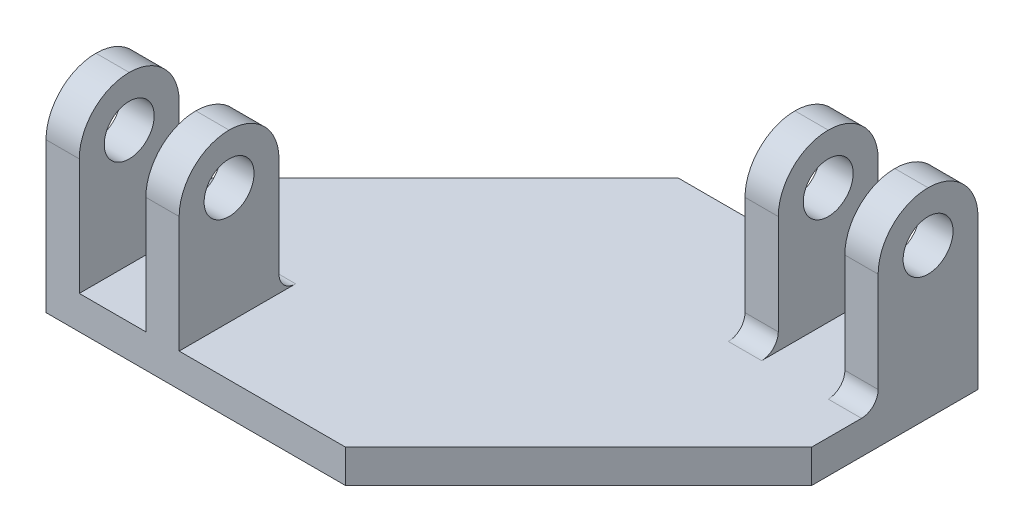
ISO-10303-21;
HEADER;
FILE_DESCRIPTION(('STEP AP214'),'2;1');
FILE_NAME('part.step','',(''),(''),'','','');
FILE_SCHEMA(('AUTOMOTIVE_DESIGN { 1 0 10303 214 1 1 1 1 }'));
ENDSEC;
DATA;
#1=APPLICATION_CONTEXT('core data for automotive mechanical design processes');
#2=APPLICATION_PROTOCOL_DEFINITION('international standard','automotive_design',2000,#1);
#3=PRODUCT_CONTEXT('',#1,'mechanical');
#4=PRODUCT('Part','Part','',(#3));
#5=PRODUCT_RELATED_PRODUCT_CATEGORY('part','',(#4));
#6=PRODUCT_DEFINITION_FORMATION('','',#4);
#7=PRODUCT_DEFINITION_CONTEXT('part definition',#1,'design');
#8=PRODUCT_DEFINITION('design','',#6,#7);
#9=PRODUCT_DEFINITION_SHAPE('','',#8);
#10=(LENGTH_UNIT() NAMED_UNIT(*) SI_UNIT(.MILLI.,.METRE.));
#11=(NAMED_UNIT(*) PLANE_ANGLE_UNIT() SI_UNIT($,.RADIAN.));
#12=(NAMED_UNIT(*) SI_UNIT($,.STERADIAN.) SOLID_ANGLE_UNIT());
#13=UNCERTAINTY_MEASURE_WITH_UNIT(LENGTH_MEASURE(1.E-05),#10,'distance_accuracy_value','');
#14=(GEOMETRIC_REPRESENTATION_CONTEXT(3) GLOBAL_UNCERTAINTY_ASSIGNED_CONTEXT((#13)) GLOBAL_UNIT_ASSIGNED_CONTEXT((#10,
#11,#12)) REPRESENTATION_CONTEXT('',''));
#15=CARTESIAN_POINT('',(0.,0.,0.));
#16=DIRECTION('',(0.,0.,1.));
#17=DIRECTION('',(1.,0.,0.));
#18=AXIS2_PLACEMENT_3D('',#15,#16,#17);
#19=CARTESIAN_POINT('',(0.,6.35,0.));
#20=DIRECTION('',(0.,1.,0.));
#21=DIRECTION('',(0.,0.,1.));
#22=AXIS2_PLACEMENT_3D('',#19,#20,#21);
#23=PLANE('',#22);
#24=DIRECTION('',(1.,0.,0.));
#25=VECTOR('',#24,1.);
#26=CARTESIAN_POINT('',(50.8,6.35,38.1));
#27=LINE('',#26,#25);
#28=CARTESIAN_POINT('',(-25.4,6.35,38.1));
#29=VERTEX_POINT('',#28);
#30=CARTESIAN_POINT('',(6.34999999999986,6.35,38.1));
#31=VERTEX_POINT('',#30);
#32=EDGE_CURVE('E294',#29,#31,#27,.T.);
#33=ORIENTED_EDGE('',*,*,#32,.T.);
#34=DIRECTION('',(-0.707106781186549,0.,0.707106781186546));
#35=VECTOR('',#34,1.);
#36=CARTESIAN_POINT('',(22.2249999999999,6.35,22.225));
#37=LINE('',#36,#35);
#38=CARTESIAN_POINT('',(50.8,6.35,-6.34999999999997));
#39=VERTEX_POINT('',#38);
#40=EDGE_CURVE('E439',#31,#39,#37,.F.);
#41=ORIENTED_EDGE('',*,*,#40,.T.);
#42=DIRECTION('',(0.,0.,-1.));
#43=VECTOR('',#42,1.);
#44=CARTESIAN_POINT('',(50.8,6.35,38.1));
#45=LINE('',#44,#43);
#46=CARTESIAN_POINT('',(50.8,6.35,-15.875));
#47=VERTEX_POINT('',#46);
#48=EDGE_CURVE('E299',#39,#47,#45,.T.);
#49=ORIENTED_EDGE('',*,*,#48,.T.);
#50=DIRECTION('',(-1.,0.,0.));
#51=VECTOR('',#50,1.);
#52=CARTESIAN_POINT('',(44.45,6.35,-15.875));
#53=LINE('',#52,#51);
#54=CARTESIAN_POINT('',(44.45,6.35,-15.875));
#55=VERTEX_POINT('',#54);
#56=EDGE_CURVE('E248',#47,#55,#53,.T.);
#57=ORIENTED_EDGE('',*,*,#56,.T.);
#58=DIRECTION('',(0.,0.,1.));
#59=VECTOR('',#58,1.);
#60=CARTESIAN_POINT('',(44.45,6.35,0.));
#61=LINE('',#60,#59);
#62=CARTESIAN_POINT('',(44.45,6.35,-38.1));
#63=VERTEX_POINT('',#62);
#64=EDGE_CURVE('E226',#63,#55,#61,.T.);
#65=ORIENTED_EDGE('',*,*,#64,.F.);
#66=DIRECTION('',(-1.,0.,0.));
#67=VECTOR('',#66,1.);
#68=CARTESIAN_POINT('',(50.8,6.35,-38.1));
#69=LINE('',#68,#67);
#70=CARTESIAN_POINT('',(31.75,6.35,-38.1));
#71=VERTEX_POINT('',#70);
#72=EDGE_CURVE('E236',#63,#71,#69,.T.);
#73=ORIENTED_EDGE('',*,*,#72,.T.);
#74=DIRECTION('',(0.,0.,1.));
#75=VECTOR('',#74,1.);
#76=CARTESIAN_POINT('',(31.75,6.35,0.));
#77=LINE('',#76,#75);
#78=CARTESIAN_POINT('',(31.75,6.35,-15.875));
#79=VERTEX_POINT('',#78);
#80=EDGE_CURVE('E232',#71,#79,#77,.T.);
#81=ORIENTED_EDGE('',*,*,#80,.T.);
#82=DIRECTION('',(-1.,0.,0.));
#83=VECTOR('',#82,1.);
#84=CARTESIAN_POINT('',(25.4,6.35,-15.875));
#85=LINE('',#84,#83);
#86=CARTESIAN_POINT('',(25.4,6.35,-15.875));
#87=VERTEX_POINT('',#86);
#88=EDGE_CURVE('E328',#79,#87,#85,.T.);
#89=ORIENTED_EDGE('',*,*,#88,.T.);
#90=DIRECTION('',(0.,0.,1.));
#91=VECTOR('',#90,1.);
#92=CARTESIAN_POINT('',(25.4,6.35,0.));
#93=LINE('',#92,#91);
#94=CARTESIAN_POINT('',(25.4,6.35,-38.1));
#95=VERTEX_POINT('',#94);
#96=EDGE_CURVE('E260',#95,#87,#93,.T.);
#97=ORIENTED_EDGE('',*,*,#96,.F.);
#98=CARTESIAN_POINT('',(-6.34999999999984,6.35,-38.1));
#99=VERTEX_POINT('',#98);
#100=EDGE_CURVE('E243',#95,#99,#69,.T.);
#101=ORIENTED_EDGE('',*,*,#100,.T.);
#102=DIRECTION('',(0.707106781186549,0.,-0.707106781186546));
#103=VECTOR('',#102,1.);
#104=CARTESIAN_POINT('',(-22.2249999999999,6.35,-22.225));
#105=LINE('',#104,#103);
#106=CARTESIAN_POINT('',(-50.8,6.35,6.35));
#107=VERTEX_POINT('',#106);
#108=EDGE_CURVE('E52',#99,#107,#105,.F.);
#109=ORIENTED_EDGE('',*,*,#108,.T.);
#110=DIRECTION('',(0.,0.,1.));
#111=VECTOR('',#110,1.);
#112=CARTESIAN_POINT('',(-50.8,6.35,38.1));
#113=LINE('',#112,#111);
#114=CARTESIAN_POINT('',(-50.8,6.35,15.875));
#115=VERTEX_POINT('',#114);
#116=EDGE_CURVE('E292',#107,#115,#113,.T.);
#117=ORIENTED_EDGE('',*,*,#116,.T.);
#118=DIRECTION('',(1.,0.,0.));
#119=VECTOR('',#118,1.);
#120=CARTESIAN_POINT('',(-44.45,6.35,15.875));
#121=LINE('',#120,#119);
#122=CARTESIAN_POINT('',(-44.45,6.35,15.875));
#123=VERTEX_POINT('',#122);
#124=EDGE_CURVE('E325',#115,#123,#121,.T.);
#125=ORIENTED_EDGE('',*,*,#124,.T.);
#126=DIRECTION('',(0.,0.,1.));
#127=VECTOR('',#126,1.);
#128=CARTESIAN_POINT('',(-44.45,6.35,0.));
#129=LINE('',#128,#127);
#130=CARTESIAN_POINT('',(-44.45,6.35,38.1));
#131=VERTEX_POINT('',#130);
#132=EDGE_CURVE('E282',#123,#131,#129,.T.);
#133=ORIENTED_EDGE('',*,*,#132,.T.);
#134=CARTESIAN_POINT('',(-31.75,6.35,38.1));
#135=VERTEX_POINT('',#134);
#136=EDGE_CURVE('E296',#131,#135,#27,.T.);
#137=ORIENTED_EDGE('',*,*,#136,.T.);
#138=DIRECTION('',(0.,0.,1.));
#139=VECTOR('',#138,1.);
#140=CARTESIAN_POINT('',(-31.75,6.35,0.));
#141=LINE('',#140,#139);
#142=CARTESIAN_POINT('',(-31.75,6.35,15.875));
#143=VERTEX_POINT('',#142);
#144=EDGE_CURVE('E269',#143,#135,#141,.T.);
#145=ORIENTED_EDGE('',*,*,#144,.F.);
#146=DIRECTION('',(1.,0.,0.));
#147=VECTOR('',#146,1.);
#148=CARTESIAN_POINT('',(-25.4,6.35,15.875));
#149=LINE('',#148,#147);
#150=CARTESIAN_POINT('',(-25.4,6.35,15.875));
#151=VERTEX_POINT('',#150);
#152=EDGE_CURVE('E313',#143,#151,#149,.T.);
#153=ORIENTED_EDGE('',*,*,#152,.T.);
#154=DIRECTION('',(0.,0.,-1.));
#155=VECTOR('',#154,1.);
#156=CARTESIAN_POINT('',(-25.4,6.35,0.));
#157=LINE('',#156,#155);
#158=EDGE_CURVE('E272',#29,#151,#157,.T.);
#159=ORIENTED_EDGE('',*,*,#158,.F.);
#160=EDGE_LOOP('',(#33,#41,#49,#57,#65,#73,#81,#89,#97,#101,#109,#117,#125,#133,#137,#145,#153,#159));
#161=FACE_BOUND('',#160,.T.);
#162=ADVANCED_FACE('F37',(#161),#23,.T.);
#163=CARTESIAN_POINT('',(-50.8,6.35,38.1));
#164=DIRECTION('',(1.,0.,0.));
#165=DIRECTION('',(0.,0.,-1.));
#166=AXIS2_PLACEMENT_3D('',#163,#164,#165);
#167=PLANE('',#166);
#168=CARTESIAN_POINT('',(-50.8,28.575,28.575));
#169=DIRECTION('',(1.,0.,0.));
#170=DIRECTION('',(0.,0.,-1.));
#171=AXIS2_PLACEMENT_3D('',#168,#169,#170);
#172=CIRCLE('',#171,4.7625);
#173=CARTESIAN_POINT('',(-50.8,28.575,23.8125));
#174=VERTEX_POINT('',#173);
#175=EDGE_CURVE('E420',#174,#174,#172,.T.);
#176=ORIENTED_EDGE('',*,*,#175,.T.);
#177=EDGE_LOOP('',(#176));
#178=FACE_BOUND('',#177,.T.);
#179=ORIENTED_EDGE('',*,*,#116,.F.);
#180=DIRECTION('',(0.,-1.,0.));
#181=VECTOR('',#180,1.);
#182=CARTESIAN_POINT('',(-50.8,6.35,6.34999999999999));
#183=LINE('',#182,#181);
#184=CARTESIAN_POINT('',(-50.8,0.,6.35));
#185=VERTEX_POINT('',#184);
#186=EDGE_CURVE('E45',#107,#185,#183,.T.);
#187=ORIENTED_EDGE('',*,*,#186,.T.);
#188=DIRECTION('',(0.,0.,1.));
#189=VECTOR('',#188,1.);
#190=CARTESIAN_POINT('',(-50.8,0.,38.1));
#191=LINE('',#190,#189);
#192=CARTESIAN_POINT('',(-50.8,0.,38.1));
#193=VERTEX_POINT('',#192);
#194=EDGE_CURVE('E291',#185,#193,#191,.T.);
#195=ORIENTED_EDGE('',*,*,#194,.T.);
#196=DIRECTION('',(0.,-1.,0.));
#197=VECTOR('',#196,1.);
#198=CARTESIAN_POINT('',(-50.8,6.35,38.1));
#199=LINE('',#198,#197);
#200=CARTESIAN_POINT('',(-50.8,28.575,38.1));
#201=VERTEX_POINT('',#200);
#202=EDGE_CURVE('E310',#201,#193,#199,.T.);
#203=ORIENTED_EDGE('',*,*,#202,.F.);
#204=CARTESIAN_POINT('',(-50.8,28.575,28.575));
#205=DIRECTION('',(1.,0.,0.));
#206=DIRECTION('',(0.,0.,-1.));
#207=AXIS2_PLACEMENT_3D('',#204,#205,#206);
#208=CIRCLE('',#207,9.525);
#209=CARTESIAN_POINT('',(-50.8,38.1,28.575));
#210=VERTEX_POINT('',#209);
#211=EDGE_CURVE('E398',#201,#210,#208,.F.);
#212=ORIENTED_EDGE('',*,*,#211,.T.);
#213=CARTESIAN_POINT('',(-50.8,28.575,28.575));
#214=DIRECTION('',(1.,0.,0.));
#215=DIRECTION('',(0.,0.,-1.));
#216=AXIS2_PLACEMENT_3D('',#213,#214,#215);
#217=CIRCLE('',#216,9.525);
#218=CARTESIAN_POINT('',(-50.8,28.575,19.05));
#219=VERTEX_POINT('',#218);
#220=EDGE_CURVE('E396',#210,#219,#217,.F.);
#221=ORIENTED_EDGE('',*,*,#220,.T.);
#222=DIRECTION('',(0.,-1.,0.));
#223=VECTOR('',#222,1.);
#224=CARTESIAN_POINT('',(-50.8,38.1,19.05));
#225=LINE('',#224,#223);
#226=CARTESIAN_POINT('',(-50.8,9.525,19.05));
#227=VERTEX_POINT('',#226);
#228=EDGE_CURVE('E289',#219,#227,#225,.T.);
#229=ORIENTED_EDGE('',*,*,#228,.T.);
#230=CARTESIAN_POINT('',(-50.8,9.525,15.875));
#231=DIRECTION('',(1.,0.,0.));
#232=DIRECTION('',(0.,0.,-1.));
#233=AXIS2_PLACEMENT_3D('',#230,#231,#232);
#234=CIRCLE('',#233,3.175);
#235=EDGE_CURVE('E358',#227,#115,#234,.T.);
#236=ORIENTED_EDGE('',*,*,#235,.T.);
#237=EDGE_LOOP('',(#179,#187,#195,#203,#212,#221,#229,#236));
#238=FACE_BOUND('',#237,.T.);
#239=ADVANCED_FACE('F444',(#178,#238),#167,.F.);
#240=CARTESIAN_POINT('',(50.8,6.35,38.1));
#241=DIRECTION('',(0.,0.,-1.));
#242=DIRECTION('',(-1.,0.,0.));
#243=AXIS2_PLACEMENT_3D('',#240,#241,#242);
#244=PLANE('',#243);
#245=DIRECTION('',(1.,0.,0.));
#246=VECTOR('',#245,1.);
#247=CARTESIAN_POINT('',(50.8,0.,38.1));
#248=LINE('',#247,#246);
#249=CARTESIAN_POINT('',(6.34999999999986,0.,38.1));
#250=VERTEX_POINT('',#249);
#251=EDGE_CURVE('E302',#193,#250,#248,.T.);
#252=ORIENTED_EDGE('',*,*,#251,.T.);
#253=DIRECTION('',(0.,1.,0.));
#254=VECTOR('',#253,1.);
#255=CARTESIAN_POINT('',(6.34999999999986,6.35,38.1));
#256=LINE('',#255,#254);
#257=EDGE_CURVE('E436',#250,#31,#256,.T.);
#258=ORIENTED_EDGE('',*,*,#257,.T.);
#259=ORIENTED_EDGE('',*,*,#32,.F.);
#260=DIRECTION('',(0.,-1.,0.));
#261=VECTOR('',#260,1.);
#262=CARTESIAN_POINT('',(-25.4,38.1,38.1));
#263=LINE('',#262,#261);
#264=CARTESIAN_POINT('',(-25.4,28.575,38.1));
#265=VERTEX_POINT('',#264);
#266=EDGE_CURVE('E276',#265,#29,#263,.T.);
#267=ORIENTED_EDGE('',*,*,#266,.F.);
#268=DIRECTION('',(1.,0.,0.));
#269=VECTOR('',#268,1.);
#270=CARTESIAN_POINT('',(-31.75,28.575,38.1));
#271=LINE('',#270,#269);
#272=CARTESIAN_POINT('',(-31.75,28.575,38.1));
#273=VERTEX_POINT('',#272);
#274=EDGE_CURVE('E390',#265,#273,#271,.F.);
#275=ORIENTED_EDGE('',*,*,#274,.T.);
#276=DIRECTION('',(0.,-1.,0.));
#277=VECTOR('',#276,1.);
#278=CARTESIAN_POINT('',(-31.75,38.1,38.1));
#279=LINE('',#278,#277);
#280=EDGE_CURVE('E278',#273,#135,#279,.T.);
#281=ORIENTED_EDGE('',*,*,#280,.T.);
#282=ORIENTED_EDGE('',*,*,#136,.F.);
#283=DIRECTION('',(0.,-1.,0.));
#284=VECTOR('',#283,1.);
#285=CARTESIAN_POINT('',(-44.45,38.1,38.1));
#286=LINE('',#285,#284);
#287=CARTESIAN_POINT('',(-44.45,28.575,38.1));
#288=VERTEX_POINT('',#287);
#289=EDGE_CURVE('E287',#288,#131,#286,.T.);
#290=ORIENTED_EDGE('',*,*,#289,.F.);
#291=DIRECTION('',(1.,0.,0.));
#292=VECTOR('',#291,1.);
#293=CARTESIAN_POINT('',(-50.8,28.575,38.1));
#294=LINE('',#293,#292);
#295=EDGE_CURVE('E393',#288,#201,#294,.F.);
#296=ORIENTED_EDGE('',*,*,#295,.T.);
#297=ORIENTED_EDGE('',*,*,#202,.T.);
#298=EDGE_LOOP('',(#252,#258,#259,#267,#275,#281,#282,#290,#296,#297));
#299=FACE_BOUND('',#298,.T.);
#300=ADVANCED_FACE('F454',(#299),#244,.F.);
#301=CARTESIAN_POINT('',(50.8,6.35,38.1));
#302=DIRECTION('',(-1.,0.,0.));
#303=DIRECTION('',(0.,0.,1.));
#304=AXIS2_PLACEMENT_3D('',#301,#302,#303);
#305=PLANE('',#304);
#306=CARTESIAN_POINT('',(50.8,28.575,-28.575));
#307=DIRECTION('',(1.,0.,0.));
#308=DIRECTION('',(0.,0.,-1.));
#309=AXIS2_PLACEMENT_3D('',#306,#307,#308);
#310=CIRCLE('',#309,4.7625);
#311=CARTESIAN_POINT('',(50.8,28.575,-33.3375));
#312=VERTEX_POINT('',#311);
#313=EDGE_CURVE('E318',#312,#312,#310,.T.);
#314=ORIENTED_EDGE('',*,*,#313,.F.);
#315=EDGE_LOOP('',(#314));
#316=FACE_BOUND('',#315,.T.);
#317=ORIENTED_EDGE('',*,*,#48,.F.);
#318=DIRECTION('',(0.,-1.,0.));
#319=VECTOR('',#318,1.);
#320=CARTESIAN_POINT('',(50.8,6.35,-6.34999999999999));
#321=LINE('',#320,#319);
#322=CARTESIAN_POINT('',(50.8,0.,-6.34999999999997));
#323=VERTEX_POINT('',#322);
#324=EDGE_CURVE('E416',#39,#323,#321,.T.);
#325=ORIENTED_EDGE('',*,*,#324,.T.);
#326=DIRECTION('',(0.,0.,-1.));
#327=VECTOR('',#326,1.);
#328=CARTESIAN_POINT('',(50.8,0.,38.1));
#329=LINE('',#328,#327);
#330=CARTESIAN_POINT('',(50.8,0.,-38.1));
#331=VERTEX_POINT('',#330);
#332=EDGE_CURVE('E305',#323,#331,#329,.T.);
#333=ORIENTED_EDGE('',*,*,#332,.T.);
#334=DIRECTION('',(0.,-1.,0.));
#335=VECTOR('',#334,1.);
#336=CARTESIAN_POINT('',(50.8,6.35,-38.1));
#337=LINE('',#336,#335);
#338=CARTESIAN_POINT('',(50.8,28.575,-38.1));
#339=VERTEX_POINT('',#338);
#340=EDGE_CURVE('E242',#339,#331,#337,.T.);
#341=ORIENTED_EDGE('',*,*,#340,.F.);
#342=CARTESIAN_POINT('',(50.8,28.575,-28.575));
#343=DIRECTION('',(-1.,0.,0.));
#344=DIRECTION('',(0.,0.,1.));
#345=AXIS2_PLACEMENT_3D('',#342,#343,#344);
#346=CIRCLE('',#345,9.525);
#347=CARTESIAN_POINT('',(50.8,38.1,-28.575));
#348=VERTEX_POINT('',#347);
#349=EDGE_CURVE('E384',#339,#348,#346,.F.);
#350=ORIENTED_EDGE('',*,*,#349,.T.);
#351=CARTESIAN_POINT('',(50.8,28.575,-28.575));
#352=DIRECTION('',(-1.,0.,0.));
#353=DIRECTION('',(0.,0.,1.));
#354=AXIS2_PLACEMENT_3D('',#351,#352,#353);
#355=CIRCLE('',#354,9.525);
#356=CARTESIAN_POINT('',(50.8,28.575,-19.05));
#357=VERTEX_POINT('',#356);
#358=EDGE_CURVE('E382',#348,#357,#355,.F.);
#359=ORIENTED_EDGE('',*,*,#358,.T.);
#360=DIRECTION('',(0.,-1.,0.));
#361=VECTOR('',#360,1.);
#362=CARTESIAN_POINT('',(50.8,38.1,-19.05));
#363=LINE('',#362,#361);
#364=CARTESIAN_POINT('',(50.8,9.525,-19.05));
#365=VERTEX_POINT('',#364);
#366=EDGE_CURVE('E249',#357,#365,#363,.T.);
#367=ORIENTED_EDGE('',*,*,#366,.T.);
#368=CARTESIAN_POINT('',(50.8,9.525,-15.875));
#369=DIRECTION('',(-1.,0.,0.));
#370=DIRECTION('',(0.,0.,1.));
#371=AXIS2_PLACEMENT_3D('',#368,#369,#370);
#372=CIRCLE('',#371,3.175);
#373=EDGE_CURVE('E346',#365,#47,#372,.T.);
#374=ORIENTED_EDGE('',*,*,#373,.T.);
#375=EDGE_LOOP('',(#317,#325,#333,#341,#350,#359,#367,#374));
#376=FACE_BOUND('',#375,.T.);
#377=ADVANCED_FACE('F463',(#316,#376),#305,.F.);
#378=CARTESIAN_POINT('',(50.8,6.35,-38.1));
#379=DIRECTION('',(0.,0.,1.));
#380=DIRECTION('',(1.,0.,0.));
#381=AXIS2_PLACEMENT_3D('',#378,#379,#380);
#382=PLANE('',#381);
#383=DIRECTION('',(-1.,0.,0.));
#384=VECTOR('',#383,1.);
#385=CARTESIAN_POINT('',(50.8,0.,-38.1));
#386=LINE('',#385,#384);
#387=CARTESIAN_POINT('',(-6.34999999999984,0.,-38.1));
#388=VERTEX_POINT('',#387);
#389=EDGE_CURVE('E295',#331,#388,#386,.T.);
#390=ORIENTED_EDGE('',*,*,#389,.T.);
#391=DIRECTION('',(0.,1.,0.));
#392=VECTOR('',#391,1.);
#393=CARTESIAN_POINT('',(-6.34999999999984,6.35,-38.1));
#394=LINE('',#393,#392);
#395=EDGE_CURVE('E11',#388,#99,#394,.T.);
#396=ORIENTED_EDGE('',*,*,#395,.T.);
#397=ORIENTED_EDGE('',*,*,#100,.F.);
#398=DIRECTION('',(0.,-1.,0.));
#399=VECTOR('',#398,1.);
#400=CARTESIAN_POINT('',(25.4,38.1,-38.1));
#401=LINE('',#400,#399);
#402=CARTESIAN_POINT('',(25.4,28.575,-38.1));
#403=VERTEX_POINT('',#402);
#404=EDGE_CURVE('E266',#403,#95,#401,.T.);
#405=ORIENTED_EDGE('',*,*,#404,.F.);
#406=DIRECTION('',(-1.,0.,0.));
#407=VECTOR('',#406,1.);
#408=CARTESIAN_POINT('',(31.75,28.575,-38.1));
#409=LINE('',#408,#407);
#410=CARTESIAN_POINT('',(31.75,28.575,-38.1));
#411=VERTEX_POINT('',#410);
#412=EDGE_CURVE('E373',#403,#411,#409,.F.);
#413=ORIENTED_EDGE('',*,*,#412,.T.);
#414=DIRECTION('',(0.,-1.,0.));
#415=VECTOR('',#414,1.);
#416=CARTESIAN_POINT('',(31.75,38.1,-38.1));
#417=LINE('',#416,#415);
#418=EDGE_CURVE('E240',#411,#71,#417,.T.);
#419=ORIENTED_EDGE('',*,*,#418,.T.);
#420=ORIENTED_EDGE('',*,*,#72,.F.);
#421=DIRECTION('',(0.,-1.,0.));
#422=VECTOR('',#421,1.);
#423=CARTESIAN_POINT('',(44.45,38.1,-38.1));
#424=LINE('',#423,#422);
#425=CARTESIAN_POINT('',(44.45,28.575,-38.1));
#426=VERTEX_POINT('',#425);
#427=EDGE_CURVE('E221',#426,#63,#424,.T.);
#428=ORIENTED_EDGE('',*,*,#427,.F.);
#429=DIRECTION('',(-1.,0.,0.));
#430=VECTOR('',#429,1.);
#431=CARTESIAN_POINT('',(50.8,28.575,-38.1));
#432=LINE('',#431,#430);
#433=EDGE_CURVE('E371',#426,#339,#432,.F.);
#434=ORIENTED_EDGE('',*,*,#433,.T.);
#435=ORIENTED_EDGE('',*,*,#340,.T.);
#436=EDGE_LOOP('',(#390,#396,#397,#405,#413,#419,#420,#428,#434,#435));
#437=FACE_BOUND('',#436,.T.);
#438=ADVANCED_FACE('F237',(#437),#382,.F.);
#439=CARTESIAN_POINT('',(0.,0.,0.));
#440=DIRECTION('',(0.,1.,0.));
#441=DIRECTION('',(0.,0.,1.));
#442=AXIS2_PLACEMENT_3D('',#439,#440,#441);
#443=PLANE('',#442);
#444=ORIENTED_EDGE('',*,*,#332,.F.);
#445=DIRECTION('',(0.707106781186549,0.,-0.707106781186546));
#446=VECTOR('',#445,1.);
#447=CARTESIAN_POINT('',(50.8,0.,-6.34999999999999));
#448=LINE('',#447,#446);
#449=EDGE_CURVE('E434',#323,#250,#448,.F.);
#450=ORIENTED_EDGE('',*,*,#449,.T.);
#451=ORIENTED_EDGE('',*,*,#251,.F.);
#452=ORIENTED_EDGE('',*,*,#194,.F.);
#453=DIRECTION('',(-0.707106781186549,0.,0.707106781186546));
#454=VECTOR('',#453,1.);
#455=CARTESIAN_POINT('',(-50.8,0.,6.34999999999999));
#456=LINE('',#455,#454);
#457=EDGE_CURVE('E432',#185,#388,#456,.F.);
#458=ORIENTED_EDGE('',*,*,#457,.T.);
#459=ORIENTED_EDGE('',*,*,#389,.F.);
#460=EDGE_LOOP('',(#444,#450,#451,#452,#458,#459));
#461=FACE_BOUND('',#460,.T.);
#462=ADVANCED_FACE('F450',(#461),#443,.F.);
#463=CARTESIAN_POINT('',(0.,38.1,19.05));
#464=DIRECTION('',(0.,0.,-1.));
#465=DIRECTION('',(-1.,0.,0.));
#466=AXIS2_PLACEMENT_3D('',#463,#464,#465);
#467=PLANE('',#466);
#468=ORIENTED_EDGE('',*,*,#228,.F.);
#469=DIRECTION('',(1.,0.,0.));
#470=VECTOR('',#469,1.);
#471=CARTESIAN_POINT('',(0.,28.575,19.05));
#472=LINE('',#471,#470);
#473=CARTESIAN_POINT('',(-44.45,28.575,19.05));
#474=VERTEX_POINT('',#473);
#475=EDGE_CURVE('E408',#219,#474,#472,.T.);
#476=ORIENTED_EDGE('',*,*,#475,.T.);
#477=DIRECTION('',(0.,-1.,0.));
#478=VECTOR('',#477,1.);
#479=CARTESIAN_POINT('',(-44.45,38.1,19.05));
#480=LINE('',#479,#478);
#481=CARTESIAN_POINT('',(-44.45,9.525,19.05));
#482=VERTEX_POINT('',#481);
#483=EDGE_CURVE('E285',#474,#482,#480,.T.);
#484=ORIENTED_EDGE('',*,*,#483,.T.);
#485=DIRECTION('',(1.,0.,0.));
#486=VECTOR('',#485,1.);
#487=CARTESIAN_POINT('',(-50.8,9.525,19.05));
#488=LINE('',#487,#486);
#489=EDGE_CURVE('E338',#482,#227,#488,.F.);
#490=ORIENTED_EDGE('',*,*,#489,.T.);
#491=EDGE_LOOP('',(#468,#476,#484,#490));
#492=FACE_BOUND('',#491,.T.);
#493=ADVANCED_FACE('F495',(#492),#467,.T.);
#494=CARTESIAN_POINT('',(-44.45,38.1,0.));
#495=DIRECTION('',(1.,0.,0.));
#496=DIRECTION('',(0.,0.,-1.));
#497=AXIS2_PLACEMENT_3D('',#494,#495,#496);
#498=PLANE('',#497);
#499=CARTESIAN_POINT('',(-44.45,28.575,28.575));
#500=DIRECTION('',(1.,0.,0.));
#501=DIRECTION('',(0.,0.,-1.));
#502=AXIS2_PLACEMENT_3D('',#499,#500,#501);
#503=CIRCLE('',#502,4.7625);
#504=CARTESIAN_POINT('',(-44.45,28.575,23.8125));
#505=VERTEX_POINT('',#504);
#506=EDGE_CURVE('E250',#505,#505,#503,.T.);
#507=ORIENTED_EDGE('',*,*,#506,.F.);
#508=EDGE_LOOP('',(#507));
#509=FACE_BOUND('',#508,.T.);
#510=CARTESIAN_POINT('',(-44.45,28.575,28.575));
#511=DIRECTION('',(1.,0.,0.));
#512=DIRECTION('',(0.,0.,-1.));
#513=AXIS2_PLACEMENT_3D('',#510,#511,#512);
#514=CIRCLE('',#513,9.525);
#515=CARTESIAN_POINT('',(-44.45,38.1,28.575));
#516=VERTEX_POINT('',#515);
#517=EDGE_CURVE('E386',#474,#516,#514,.T.);
#518=ORIENTED_EDGE('',*,*,#517,.T.);
#519=CARTESIAN_POINT('',(-44.45,28.575,28.575));
#520=DIRECTION('',(1.,0.,0.));
#521=DIRECTION('',(0.,0.,-1.));
#522=AXIS2_PLACEMENT_3D('',#519,#520,#521);
#523=CIRCLE('',#522,9.525);
#524=EDGE_CURVE('E388',#516,#288,#523,.T.);
#525=ORIENTED_EDGE('',*,*,#524,.T.);
#526=ORIENTED_EDGE('',*,*,#289,.T.);
#527=ORIENTED_EDGE('',*,*,#132,.F.);
#528=CARTESIAN_POINT('',(-44.45,9.525,15.875));
#529=DIRECTION('',(1.,0.,0.));
#530=DIRECTION('',(0.,0.,-1.));
#531=AXIS2_PLACEMENT_3D('',#528,#529,#530);
#532=CIRCLE('',#531,3.175);
#533=EDGE_CURVE('E355',#123,#482,#532,.F.);
#534=ORIENTED_EDGE('',*,*,#533,.T.);
#535=ORIENTED_EDGE('',*,*,#483,.F.);
#536=EDGE_LOOP('',(#518,#525,#526,#527,#534,#535));
#537=FACE_BOUND('',#536,.T.);
#538=ADVANCED_FACE('F581',(#509,#537),#498,.T.);
#539=CARTESIAN_POINT('',(0.,38.1,19.05));
#540=DIRECTION('',(0.,0.,-1.));
#541=DIRECTION('',(-1.,0.,0.));
#542=AXIS2_PLACEMENT_3D('',#539,#540,#541);
#543=PLANE('',#542);
#544=DIRECTION('',(0.,-1.,0.));
#545=VECTOR('',#544,1.);
#546=CARTESIAN_POINT('',(-31.75,38.1,19.05));
#547=LINE('',#546,#545);
#548=CARTESIAN_POINT('',(-31.75,28.575,19.05));
#549=VERTEX_POINT('',#548);
#550=CARTESIAN_POINT('',(-31.75,9.525,19.05));
#551=VERTEX_POINT('',#550);
#552=EDGE_CURVE('E280',#549,#551,#547,.T.);
#553=ORIENTED_EDGE('',*,*,#552,.F.);
#554=DIRECTION('',(1.,0.,0.));
#555=VECTOR('',#554,1.);
#556=CARTESIAN_POINT('',(0.,28.575,19.05));
#557=LINE('',#556,#555);
#558=CARTESIAN_POINT('',(-25.4,28.575,19.05));
#559=VERTEX_POINT('',#558);
#560=EDGE_CURVE('E410',#549,#559,#557,.T.);
#561=ORIENTED_EDGE('',*,*,#560,.T.);
#562=DIRECTION('',(0.,-1.,0.));
#563=VECTOR('',#562,1.);
#564=CARTESIAN_POINT('',(-25.4,38.1,19.05));
#565=LINE('',#564,#563);
#566=CARTESIAN_POINT('',(-25.4,9.525,19.05));
#567=VERTEX_POINT('',#566);
#568=EDGE_CURVE('E274',#559,#567,#565,.T.);
#569=ORIENTED_EDGE('',*,*,#568,.T.);
#570=DIRECTION('',(1.,0.,0.));
#571=VECTOR('',#570,1.);
#572=CARTESIAN_POINT('',(-31.75,9.525,19.05));
#573=LINE('',#572,#571);
#574=EDGE_CURVE('E341',#567,#551,#573,.F.);
#575=ORIENTED_EDGE('',*,*,#574,.T.);
#576=EDGE_LOOP('',(#553,#561,#569,#575));
#577=FACE_BOUND('',#576,.T.);
#578=ADVANCED_FACE('F556',(#577),#543,.T.);
#579=CARTESIAN_POINT('',(-31.75,38.1,0.));
#580=DIRECTION('',(1.,0.,0.));
#581=DIRECTION('',(0.,0.,-1.));
#582=AXIS2_PLACEMENT_3D('',#579,#580,#581);
#583=PLANE('',#582);
#584=CARTESIAN_POINT('',(-31.75,28.575,28.575));
#585=DIRECTION('',(1.,0.,0.));
#586=DIRECTION('',(0.,0.,-1.));
#587=AXIS2_PLACEMENT_3D('',#584,#585,#586);
#588=CIRCLE('',#587,4.7625);
#589=CARTESIAN_POINT('',(-31.75,28.575,23.8125));
#590=VERTEX_POINT('',#589);
#591=EDGE_CURVE('E254',#590,#590,#588,.T.);
#592=ORIENTED_EDGE('',*,*,#591,.T.);
#593=EDGE_LOOP('',(#592));
#594=FACE_BOUND('',#593,.T.);
#595=ORIENTED_EDGE('',*,*,#280,.F.);
#596=CARTESIAN_POINT('',(-31.75,28.575,28.575));
#597=DIRECTION('',(1.,0.,0.));
#598=DIRECTION('',(0.,0.,-1.));
#599=AXIS2_PLACEMENT_3D('',#596,#597,#598);
#600=CIRCLE('',#599,9.525);
#601=CARTESIAN_POINT('',(-31.75,38.1,28.575));
#602=VERTEX_POINT('',#601);
#603=EDGE_CURVE('E406',#273,#602,#600,.F.);
#604=ORIENTED_EDGE('',*,*,#603,.T.);
#605=CARTESIAN_POINT('',(-31.75,28.575,28.575));
#606=DIRECTION('',(1.,0.,0.));
#607=DIRECTION('',(0.,0.,-1.));
#608=AXIS2_PLACEMENT_3D('',#605,#606,#607);
#609=CIRCLE('',#608,9.525);
#610=EDGE_CURVE('E404',#602,#549,#609,.F.);
#611=ORIENTED_EDGE('',*,*,#610,.T.);
#612=ORIENTED_EDGE('',*,*,#552,.T.);
#613=CARTESIAN_POINT('',(-31.75,9.525,15.875));
#614=DIRECTION('',(1.,0.,0.));
#615=DIRECTION('',(0.,0.,-1.));
#616=AXIS2_PLACEMENT_3D('',#613,#614,#615);
#617=CIRCLE('',#616,3.175);
#618=EDGE_CURVE('E364',#551,#143,#617,.T.);
#619=ORIENTED_EDGE('',*,*,#618,.T.);
#620=ORIENTED_EDGE('',*,*,#144,.T.);
#621=EDGE_LOOP('',(#595,#604,#611,#612,#619,#620));
#622=FACE_BOUND('',#621,.T.);
#623=ADVANCED_FACE('F565',(#594,#622),#583,.F.);
#624=CARTESIAN_POINT('',(-25.4,38.1,0.));
#625=DIRECTION('',(-1.,0.,0.));
#626=DIRECTION('',(0.,0.,1.));
#627=AXIS2_PLACEMENT_3D('',#624,#625,#626);
#628=PLANE('',#627);
#629=CARTESIAN_POINT('',(-25.4,28.575,28.575));
#630=DIRECTION('',(-1.,0.,0.));
#631=DIRECTION('',(0.,0.,1.));
#632=AXIS2_PLACEMENT_3D('',#629,#630,#631);
#633=CIRCLE('',#632,4.7625);
#634=CARTESIAN_POINT('',(-25.4,28.575,33.3375));
#635=VERTEX_POINT('',#634);
#636=EDGE_CURVE('E319',#635,#635,#633,.T.);
#637=ORIENTED_EDGE('',*,*,#636,.T.);
#638=EDGE_LOOP('',(#637));
#639=FACE_BOUND('',#638,.T.);
#640=CARTESIAN_POINT('',(-25.4,28.575,28.575));
#641=DIRECTION('',(-1.,0.,0.));
#642=DIRECTION('',(0.,0.,1.));
#643=AXIS2_PLACEMENT_3D('',#640,#641,#642);
#644=CIRCLE('',#643,9.525);
#645=CARTESIAN_POINT('',(-25.4,38.1,28.575));
#646=VERTEX_POINT('',#645);
#647=EDGE_CURVE('E400',#559,#646,#644,.F.);
#648=ORIENTED_EDGE('',*,*,#647,.T.);
#649=CARTESIAN_POINT('',(-25.4,28.575,28.575));
#650=DIRECTION('',(-1.,0.,0.));
#651=DIRECTION('',(0.,0.,1.));
#652=AXIS2_PLACEMENT_3D('',#649,#650,#651);
#653=CIRCLE('',#652,9.525);
#654=EDGE_CURVE('E402',#646,#265,#653,.F.);
#655=ORIENTED_EDGE('',*,*,#654,.T.);
#656=ORIENTED_EDGE('',*,*,#266,.T.);
#657=ORIENTED_EDGE('',*,*,#158,.T.);
#658=CARTESIAN_POINT('',(-25.4,9.525,15.875));
#659=DIRECTION('',(-1.,0.,0.));
#660=DIRECTION('',(0.,0.,1.));
#661=AXIS2_PLACEMENT_3D('',#658,#659,#660);
#662=CIRCLE('',#661,3.175);
#663=EDGE_CURVE('E361',#151,#567,#662,.T.);
#664=ORIENTED_EDGE('',*,*,#663,.T.);
#665=ORIENTED_EDGE('',*,*,#568,.F.);
#666=EDGE_LOOP('',(#648,#655,#656,#657,#664,#665));
#667=FACE_BOUND('',#666,.T.);
#668=ADVANCED_FACE('F558',(#639,#667),#628,.F.);
#669=CARTESIAN_POINT('',(31.75,38.1,0.));
#670=DIRECTION('',(1.,0.,0.));
#671=DIRECTION('',(0.,0.,-1.));
#672=AXIS2_PLACEMENT_3D('',#669,#670,#671);
#673=PLANE('',#672);
#674=CARTESIAN_POINT('',(31.75,28.575,-28.575));
#675=DIRECTION('',(1.,0.,0.));
#676=DIRECTION('',(0.,0.,-1.));
#677=AXIS2_PLACEMENT_3D('',#674,#675,#676);
#678=CIRCLE('',#677,4.7625);
#679=CARTESIAN_POINT('',(31.75,28.575,-33.3375));
#680=VERTEX_POINT('',#679);
#681=EDGE_CURVE('E322',#680,#680,#678,.T.);
#682=ORIENTED_EDGE('',*,*,#681,.F.);
#683=EDGE_LOOP('',(#682));
#684=FACE_BOUND('',#683,.T.);
#685=ORIENTED_EDGE('',*,*,#418,.F.);
#686=CARTESIAN_POINT('',(31.75,28.575,-28.575));
#687=DIRECTION('',(1.,0.,0.));
#688=DIRECTION('',(0.,0.,-1.));
#689=AXIS2_PLACEMENT_3D('',#686,#687,#688);
#690=CIRCLE('',#689,9.525);
#691=CARTESIAN_POINT('',(31.75,38.1,-28.575));
#692=VERTEX_POINT('',#691);
#693=EDGE_CURVE('E377',#411,#692,#690,.T.);
#694=ORIENTED_EDGE('',*,*,#693,.T.);
#695=CARTESIAN_POINT('',(31.75,28.575,-28.575));
#696=DIRECTION('',(1.,0.,0.));
#697=DIRECTION('',(0.,0.,-1.));
#698=AXIS2_PLACEMENT_3D('',#695,#696,#697);
#699=CIRCLE('',#698,9.525);
#700=CARTESIAN_POINT('',(31.75,28.575,-19.05));
#701=VERTEX_POINT('',#700);
#702=EDGE_CURVE('E375',#692,#701,#699,.T.);
#703=ORIENTED_EDGE('',*,*,#702,.T.);
#704=DIRECTION('',(0.,-1.,0.));
#705=VECTOR('',#704,1.);
#706=CARTESIAN_POINT('',(31.75,38.1,-19.05));
#707=LINE('',#706,#705);
#708=CARTESIAN_POINT('',(31.75,9.525,-19.05));
#709=VERTEX_POINT('',#708);
#710=EDGE_CURVE('E262',#701,#709,#707,.T.);
#711=ORIENTED_EDGE('',*,*,#710,.T.);
#712=CARTESIAN_POINT('',(31.75,9.525,-15.875));
#713=DIRECTION('',(1.,0.,0.));
#714=DIRECTION('',(0.,0.,-1.));
#715=AXIS2_PLACEMENT_3D('',#712,#713,#714);
#716=CIRCLE('',#715,3.175);
#717=EDGE_CURVE('E352',#709,#79,#716,.F.);
#718=ORIENTED_EDGE('',*,*,#717,.T.);
#719=ORIENTED_EDGE('',*,*,#80,.F.);
#720=EDGE_LOOP('',(#685,#694,#703,#711,#718,#719));
#721=FACE_BOUND('',#720,.T.);
#722=ADVANCED_FACE('F600',(#684,#721),#673,.T.);
#723=CARTESIAN_POINT('',(25.4,38.1,0.));
#724=DIRECTION('',(1.,0.,0.));
#725=DIRECTION('',(0.,0.,-1.));
#726=AXIS2_PLACEMENT_3D('',#723,#724,#725);
#727=PLANE('',#726);
#728=CARTESIAN_POINT('',(25.4,28.575,-28.575));
#729=DIRECTION('',(1.,0.,0.));
#730=DIRECTION('',(0.,0.,-1.));
#731=AXIS2_PLACEMENT_3D('',#728,#729,#730);
#732=CIRCLE('',#731,4.7625);
#733=CARTESIAN_POINT('',(25.4,28.575,-33.3375));
#734=VERTEX_POINT('',#733);
#735=EDGE_CURVE('E317',#734,#734,#732,.T.);
#736=ORIENTED_EDGE('',*,*,#735,.T.);
#737=EDGE_LOOP('',(#736));
#738=FACE_BOUND('',#737,.T.);
#739=CARTESIAN_POINT('',(25.4,28.575,-28.575));
#740=DIRECTION('',(1.,0.,0.));
#741=DIRECTION('',(0.,0.,-1.));
#742=AXIS2_PLACEMENT_3D('',#739,#740,#741);
#743=CIRCLE('',#742,9.525);
#744=CARTESIAN_POINT('',(25.4,28.575,-19.05));
#745=VERTEX_POINT('',#744);
#746=CARTESIAN_POINT('',(25.4,38.1,-28.575));
#747=VERTEX_POINT('',#746);
#748=EDGE_CURVE('E367',#745,#747,#743,.F.);
#749=ORIENTED_EDGE('',*,*,#748,.T.);
#750=CARTESIAN_POINT('',(25.4,28.575,-28.575));
#751=DIRECTION('',(1.,0.,0.));
#752=DIRECTION('',(0.,0.,-1.));
#753=AXIS2_PLACEMENT_3D('',#750,#751,#752);
#754=CIRCLE('',#753,9.525);
#755=EDGE_CURVE('E369',#747,#403,#754,.F.);
#756=ORIENTED_EDGE('',*,*,#755,.T.);
#757=ORIENTED_EDGE('',*,*,#404,.T.);
#758=ORIENTED_EDGE('',*,*,#96,.T.);
#759=CARTESIAN_POINT('',(25.4,9.525,-15.875));
#760=DIRECTION('',(1.,0.,0.));
#761=DIRECTION('',(0.,0.,-1.));
#762=AXIS2_PLACEMENT_3D('',#759,#760,#761);
#763=CIRCLE('',#762,3.175);
#764=CARTESIAN_POINT('',(25.4,9.525,-19.05));
#765=VERTEX_POINT('',#764);
#766=EDGE_CURVE('E349',#87,#765,#763,.T.);
#767=ORIENTED_EDGE('',*,*,#766,.T.);
#768=DIRECTION('',(0.,-1.,0.));
#769=VECTOR('',#768,1.);
#770=CARTESIAN_POINT('',(25.4,38.1,-19.05));
#771=LINE('',#770,#769);
#772=EDGE_CURVE('E264',#745,#765,#771,.T.);
#773=ORIENTED_EDGE('',*,*,#772,.F.);
#774=EDGE_LOOP('',(#749,#756,#757,#758,#767,#773));
#775=FACE_BOUND('',#774,.T.);
#776=ADVANCED_FACE('F604',(#738,#775),#727,.F.);
#777=CARTESIAN_POINT('',(0.,38.1,-19.05));
#778=DIRECTION('',(0.,0.,1.));
#779=DIRECTION('',(1.,0.,0.));
#780=AXIS2_PLACEMENT_3D('',#777,#778,#779);
#781=PLANE('',#780);
#782=ORIENTED_EDGE('',*,*,#710,.F.);
#783=DIRECTION('',(-1.,0.,0.));
#784=VECTOR('',#783,1.);
#785=CARTESIAN_POINT('',(0.,28.575,-19.05));
#786=LINE('',#785,#784);
#787=EDGE_CURVE('E412',#701,#745,#786,.T.);
#788=ORIENTED_EDGE('',*,*,#787,.T.);
#789=ORIENTED_EDGE('',*,*,#772,.T.);
#790=DIRECTION('',(-1.,0.,0.));
#791=VECTOR('',#790,1.);
#792=CARTESIAN_POINT('',(31.75,9.525,-19.05));
#793=LINE('',#792,#791);
#794=EDGE_CURVE('E335',#765,#709,#793,.F.);
#795=ORIENTED_EDGE('',*,*,#794,.T.);
#796=EDGE_LOOP('',(#782,#788,#789,#795));
#797=FACE_BOUND('',#796,.T.);
#798=ADVANCED_FACE('F608',(#797),#781,.T.);
#799=CARTESIAN_POINT('',(44.45,38.1,0.));
#800=DIRECTION('',(1.,0.,0.));
#801=DIRECTION('',(0.,0.,-1.));
#802=AXIS2_PLACEMENT_3D('',#799,#800,#801);
#803=PLANE('',#802);
#804=CARTESIAN_POINT('',(44.45,28.575,-28.575));
#805=DIRECTION('',(1.,0.,0.));
#806=DIRECTION('',(0.,0.,-1.));
#807=AXIS2_PLACEMENT_3D('',#804,#805,#806);
#808=CIRCLE('',#807,4.7625);
#809=CARTESIAN_POINT('',(44.45,28.575,-33.3375));
#810=VERTEX_POINT('',#809);
#811=EDGE_CURVE('E314',#810,#810,#808,.T.);
#812=ORIENTED_EDGE('',*,*,#811,.T.);
#813=EDGE_LOOP('',(#812));
#814=FACE_BOUND('',#813,.T.);
#815=CARTESIAN_POINT('',(44.45,28.575,-28.575));
#816=DIRECTION('',(1.,0.,0.));
#817=DIRECTION('',(0.,0.,-1.));
#818=AXIS2_PLACEMENT_3D('',#815,#816,#817);
#819=CIRCLE('',#818,9.525);
#820=CARTESIAN_POINT('',(44.45,28.575,-19.05));
#821=VERTEX_POINT('',#820);
#822=CARTESIAN_POINT('',(44.45,38.1,-28.575));
#823=VERTEX_POINT('',#822);
#824=EDGE_CURVE('E379',#821,#823,#819,.F.);
#825=ORIENTED_EDGE('',*,*,#824,.T.);
#826=CARTESIAN_POINT('',(44.45,28.575,-28.575));
#827=DIRECTION('',(1.,0.,0.));
#828=DIRECTION('',(0.,0.,-1.));
#829=AXIS2_PLACEMENT_3D('',#826,#827,#828);
#830=CIRCLE('',#829,9.525);
#831=EDGE_CURVE('E229',#823,#426,#830,.F.);
#832=ORIENTED_EDGE('',*,*,#831,.T.);
#833=ORIENTED_EDGE('',*,*,#427,.T.);
#834=ORIENTED_EDGE('',*,*,#64,.T.);
#835=CARTESIAN_POINT('',(44.45,9.525,-15.875));
#836=DIRECTION('',(1.,0.,0.));
#837=DIRECTION('',(0.,0.,-1.));
#838=AXIS2_PLACEMENT_3D('',#835,#836,#837);
#839=CIRCLE('',#838,3.175);
#840=CARTESIAN_POINT('',(44.45,9.525,-19.05));
#841=VERTEX_POINT('',#840);
#842=EDGE_CURVE('E344',#55,#841,#839,.T.);
#843=ORIENTED_EDGE('',*,*,#842,.T.);
#844=DIRECTION('',(0.,-1.,0.));
#845=VECTOR('',#844,1.);
#846=CARTESIAN_POINT('',(44.45,38.1,-19.05));
#847=LINE('',#846,#845);
#848=EDGE_CURVE('E233',#821,#841,#847,.T.);
#849=ORIENTED_EDGE('',*,*,#848,.F.);
#850=EDGE_LOOP('',(#825,#832,#833,#834,#843,#849));
#851=FACE_BOUND('',#850,.T.);
#852=ADVANCED_FACE('F223',(#814,#851),#803,.F.);
#853=CARTESIAN_POINT('',(0.,38.1,-19.05));
#854=DIRECTION('',(0.,0.,1.));
#855=DIRECTION('',(1.,0.,0.));
#856=AXIS2_PLACEMENT_3D('',#853,#854,#855);
#857=PLANE('',#856);
#858=ORIENTED_EDGE('',*,*,#366,.F.);
#859=DIRECTION('',(-1.,0.,0.));
#860=VECTOR('',#859,1.);
#861=CARTESIAN_POINT('',(0.,28.575,-19.05));
#862=LINE('',#861,#860);
#863=EDGE_CURVE('E414',#357,#821,#862,.T.);
#864=ORIENTED_EDGE('',*,*,#863,.T.);
#865=ORIENTED_EDGE('',*,*,#848,.T.);
#866=DIRECTION('',(-1.,0.,0.));
#867=VECTOR('',#866,1.);
#868=CARTESIAN_POINT('',(50.8,9.525,-19.05));
#869=LINE('',#868,#867);
#870=EDGE_CURVE('E332',#841,#365,#869,.F.);
#871=ORIENTED_EDGE('',*,*,#870,.T.);
#872=EDGE_LOOP('',(#858,#864,#865,#871));
#873=FACE_BOUND('',#872,.T.);
#874=ADVANCED_FACE('F615',(#873),#857,.T.);
#875=CARTESIAN_POINT('',(-50.8,28.575,-28.575));
#876=DIRECTION('',(1.,0.,0.));
#877=DIRECTION('',(0.,0.,-1.));
#878=AXIS2_PLACEMENT_3D('',#875,#876,#877);
#879=CYLINDRICAL_SURFACE('',#878,4.7625);
#880=ORIENTED_EDGE('',*,*,#313,.T.);
#881=EDGE_LOOP('',(#880));
#882=FACE_BOUND('',#881,.T.);
#883=ORIENTED_EDGE('',*,*,#811,.F.);
#884=EDGE_LOOP('',(#883));
#885=FACE_BOUND('',#884,.T.);
#886=ADVANCED_FACE('F619',(#882,#885),#879,.F.);
#887=ORIENTED_EDGE('',*,*,#681,.T.);
#888=EDGE_LOOP('',(#887));
#889=FACE_BOUND('',#888,.T.);
#890=ORIENTED_EDGE('',*,*,#735,.F.);
#891=EDGE_LOOP('',(#890));
#892=FACE_BOUND('',#891,.T.);
#893=ADVANCED_FACE('F623',(#889,#892),#879,.F.);
#894=CARTESIAN_POINT('',(-50.8,28.575,28.575));
#895=DIRECTION('',(1.,0.,0.));
#896=DIRECTION('',(0.,0.,-1.));
#897=AXIS2_PLACEMENT_3D('',#894,#895,#896);
#898=CYLINDRICAL_SURFACE('',#897,4.7625);
#899=ORIENTED_EDGE('',*,*,#636,.F.);
#900=EDGE_LOOP('',(#899));
#901=FACE_BOUND('',#900,.T.);
#902=ORIENTED_EDGE('',*,*,#591,.F.);
#903=EDGE_LOOP('',(#902));
#904=FACE_BOUND('',#903,.T.);
#905=ADVANCED_FACE('F620',(#901,#904),#898,.F.);
#906=ORIENTED_EDGE('',*,*,#506,.T.);
#907=EDGE_LOOP('',(#906));
#908=FACE_BOUND('',#907,.T.);
#909=ORIENTED_EDGE('',*,*,#175,.F.);
#910=EDGE_LOOP('',(#909));
#911=FACE_BOUND('',#910,.T.);
#912=ADVANCED_FACE('F509',(#908,#911),#898,.F.);
#913=CARTESIAN_POINT('',(0.,9.525,-15.875));
#914=DIRECTION('',(1.,0.,0.));
#915=DIRECTION('',(0.,0.,-1.));
#916=AXIS2_PLACEMENT_3D('',#913,#914,#915);
#917=CYLINDRICAL_SURFACE('',#916,3.175);
#918=ORIENTED_EDGE('',*,*,#373,.F.);
#919=ORIENTED_EDGE('',*,*,#870,.F.);
#920=ORIENTED_EDGE('',*,*,#842,.F.);
#921=ORIENTED_EDGE('',*,*,#56,.F.);
#922=EDGE_LOOP('',(#918,#919,#920,#921));
#923=FACE_BOUND('',#922,.T.);
#924=ADVANCED_FACE('F468',(#923),#917,.F.);
#925=CARTESIAN_POINT('',(0.,9.525,-15.875));
#926=DIRECTION('',(1.,0.,0.));
#927=DIRECTION('',(0.,0.,-1.));
#928=AXIS2_PLACEMENT_3D('',#925,#926,#927);
#929=CYLINDRICAL_SURFACE('',#928,3.175);
#930=ORIENTED_EDGE('',*,*,#717,.F.);
#931=ORIENTED_EDGE('',*,*,#794,.F.);
#932=ORIENTED_EDGE('',*,*,#766,.F.);
#933=ORIENTED_EDGE('',*,*,#88,.F.);
#934=EDGE_LOOP('',(#930,#931,#932,#933));
#935=FACE_BOUND('',#934,.T.);
#936=ADVANCED_FACE('F508',(#935),#929,.F.);
#937=CARTESIAN_POINT('',(0.,9.525,15.875));
#938=DIRECTION('',(-1.,0.,0.));
#939=DIRECTION('',(0.,0.,1.));
#940=AXIS2_PLACEMENT_3D('',#937,#938,#939);
#941=CYLINDRICAL_SURFACE('',#940,3.175);
#942=ORIENTED_EDGE('',*,*,#235,.F.);
#943=ORIENTED_EDGE('',*,*,#489,.F.);
#944=ORIENTED_EDGE('',*,*,#533,.F.);
#945=ORIENTED_EDGE('',*,*,#124,.F.);
#946=EDGE_LOOP('',(#942,#943,#944,#945));
#947=FACE_BOUND('',#946,.T.);
#948=ADVANCED_FACE('F512',(#947),#941,.F.);
#949=CARTESIAN_POINT('',(0.,9.525,15.875));
#950=DIRECTION('',(-1.,0.,0.));
#951=DIRECTION('',(0.,0.,1.));
#952=AXIS2_PLACEMENT_3D('',#949,#950,#951);
#953=CYLINDRICAL_SURFACE('',#952,3.175);
#954=ORIENTED_EDGE('',*,*,#618,.F.);
#955=ORIENTED_EDGE('',*,*,#574,.F.);
#956=ORIENTED_EDGE('',*,*,#663,.F.);
#957=ORIENTED_EDGE('',*,*,#152,.F.);
#958=EDGE_LOOP('',(#954,#955,#956,#957));
#959=FACE_BOUND('',#958,.T.);
#960=ADVANCED_FACE('F516',(#959),#953,.F.);
#961=CARTESIAN_POINT('',(0.,28.575,-28.575));
#962=DIRECTION('',(-1.,0.,0.));
#963=DIRECTION('',(0.,0.,1.));
#964=AXIS2_PLACEMENT_3D('',#961,#962,#963);
#965=CYLINDRICAL_SURFACE('',#964,9.525);
#966=ORIENTED_EDGE('',*,*,#787,.F.);
#967=ORIENTED_EDGE('',*,*,#702,.F.);
#968=DIRECTION('',(-1.,0.,0.));
#969=VECTOR('',#968,1.);
#970=CARTESIAN_POINT('',(0.,38.1,-28.575));
#971=LINE('',#970,#969);
#972=EDGE_CURVE('E417',#747,#692,#971,.F.);
#973=ORIENTED_EDGE('',*,*,#972,.F.);
#974=ORIENTED_EDGE('',*,*,#748,.F.);
#975=EDGE_LOOP('',(#966,#967,#973,#974));
#976=FACE_BOUND('',#975,.T.);
#977=ADVANCED_FACE('F520',(#976),#965,.T.);
#978=CARTESIAN_POINT('',(0.,28.575,-28.575));
#979=DIRECTION('',(1.,0.,0.));
#980=DIRECTION('',(0.,0.,-1.));
#981=AXIS2_PLACEMENT_3D('',#978,#979,#980);
#982=CYLINDRICAL_SURFACE('',#981,9.525);
#983=ORIENTED_EDGE('',*,*,#693,.F.);
#984=ORIENTED_EDGE('',*,*,#412,.F.);
#985=ORIENTED_EDGE('',*,*,#755,.F.);
#986=ORIENTED_EDGE('',*,*,#972,.T.);
#987=EDGE_LOOP('',(#983,#984,#985,#986));
#988=FACE_BOUND('',#987,.T.);
#989=ADVANCED_FACE('F522',(#988),#982,.T.);
#990=CARTESIAN_POINT('',(0.,28.575,-28.575));
#991=DIRECTION('',(-1.,0.,0.));
#992=DIRECTION('',(0.,0.,1.));
#993=AXIS2_PLACEMENT_3D('',#990,#991,#992);
#994=CYLINDRICAL_SURFACE('',#993,9.525);
#995=ORIENTED_EDGE('',*,*,#863,.F.);
#996=ORIENTED_EDGE('',*,*,#358,.F.);
#997=DIRECTION('',(-1.,0.,0.));
#998=VECTOR('',#997,1.);
#999=CARTESIAN_POINT('',(0.,38.1,-28.575));
#1000=LINE('',#999,#998);
#1001=EDGE_CURVE('E421',#823,#348,#1000,.F.);
#1002=ORIENTED_EDGE('',*,*,#1001,.F.);
#1003=ORIENTED_EDGE('',*,*,#824,.F.);
#1004=EDGE_LOOP('',(#995,#996,#1002,#1003));
#1005=FACE_BOUND('',#1004,.T.);
#1006=ADVANCED_FACE('F475',(#1005),#994,.T.);
#1007=CARTESIAN_POINT('',(0.,28.575,-28.575));
#1008=DIRECTION('',(1.,0.,0.));
#1009=DIRECTION('',(0.,0.,-1.));
#1010=AXIS2_PLACEMENT_3D('',#1007,#1008,#1009);
#1011=CYLINDRICAL_SURFACE('',#1010,9.525);
#1012=ORIENTED_EDGE('',*,*,#349,.F.);
#1013=ORIENTED_EDGE('',*,*,#433,.F.);
#1014=ORIENTED_EDGE('',*,*,#831,.F.);
#1015=ORIENTED_EDGE('',*,*,#1001,.T.);
#1016=EDGE_LOOP('',(#1012,#1013,#1014,#1015));
#1017=FACE_BOUND('',#1016,.T.);
#1018=ADVANCED_FACE('F478',(#1017),#1011,.T.);
#1019=CARTESIAN_POINT('',(0.,28.575,28.575));
#1020=DIRECTION('',(1.,0.,0.));
#1021=DIRECTION('',(0.,0.,-1.));
#1022=AXIS2_PLACEMENT_3D('',#1019,#1020,#1021);
#1023=CYLINDRICAL_SURFACE('',#1022,9.525);
#1024=ORIENTED_EDGE('',*,*,#475,.F.);
#1025=ORIENTED_EDGE('',*,*,#220,.F.);
#1026=DIRECTION('',(1.,0.,0.));
#1027=VECTOR('',#1026,1.);
#1028=CARTESIAN_POINT('',(0.,38.1,28.575));
#1029=LINE('',#1028,#1027);
#1030=EDGE_CURVE('E424',#516,#210,#1029,.F.);
#1031=ORIENTED_EDGE('',*,*,#1030,.F.);
#1032=ORIENTED_EDGE('',*,*,#517,.F.);
#1033=EDGE_LOOP('',(#1024,#1025,#1031,#1032));
#1034=FACE_BOUND('',#1033,.T.);
#1035=ADVANCED_FACE('F531',(#1034),#1023,.T.);
#1036=CARTESIAN_POINT('',(0.,28.575,28.575));
#1037=DIRECTION('',(-1.,0.,0.));
#1038=DIRECTION('',(0.,0.,1.));
#1039=AXIS2_PLACEMENT_3D('',#1036,#1037,#1038);
#1040=CYLINDRICAL_SURFACE('',#1039,9.525);
#1041=ORIENTED_EDGE('',*,*,#211,.F.);
#1042=ORIENTED_EDGE('',*,*,#295,.F.);
#1043=ORIENTED_EDGE('',*,*,#524,.F.);
#1044=ORIENTED_EDGE('',*,*,#1030,.T.);
#1045=EDGE_LOOP('',(#1041,#1042,#1043,#1044));
#1046=FACE_BOUND('',#1045,.T.);
#1047=ADVANCED_FACE('F534',(#1046),#1040,.T.);
#1048=CARTESIAN_POINT('',(0.,28.575,28.575));
#1049=DIRECTION('',(1.,0.,0.));
#1050=DIRECTION('',(0.,0.,-1.));
#1051=AXIS2_PLACEMENT_3D('',#1048,#1049,#1050);
#1052=CYLINDRICAL_SURFACE('',#1051,9.525);
#1053=ORIENTED_EDGE('',*,*,#560,.F.);
#1054=ORIENTED_EDGE('',*,*,#610,.F.);
#1055=DIRECTION('',(1.,0.,0.));
#1056=VECTOR('',#1055,1.);
#1057=CARTESIAN_POINT('',(0.,38.1,28.575));
#1058=LINE('',#1057,#1056);
#1059=EDGE_CURVE('E427',#646,#602,#1058,.F.);
#1060=ORIENTED_EDGE('',*,*,#1059,.F.);
#1061=ORIENTED_EDGE('',*,*,#647,.F.);
#1062=EDGE_LOOP('',(#1053,#1054,#1060,#1061));
#1063=FACE_BOUND('',#1062,.T.);
#1064=ADVANCED_FACE('F537',(#1063),#1052,.T.);
#1065=CARTESIAN_POINT('',(0.,28.575,28.575));
#1066=DIRECTION('',(-1.,0.,0.));
#1067=DIRECTION('',(0.,0.,1.));
#1068=AXIS2_PLACEMENT_3D('',#1065,#1066,#1067);
#1069=CYLINDRICAL_SURFACE('',#1068,9.525);
#1070=ORIENTED_EDGE('',*,*,#603,.F.);
#1071=ORIENTED_EDGE('',*,*,#274,.F.);
#1072=ORIENTED_EDGE('',*,*,#654,.F.);
#1073=ORIENTED_EDGE('',*,*,#1059,.T.);
#1074=EDGE_LOOP('',(#1070,#1071,#1072,#1073));
#1075=FACE_BOUND('',#1074,.T.);
#1076=ADVANCED_FACE('F484',(#1075),#1069,.T.);
#1077=CARTESIAN_POINT('',(50.8,6.35,-6.34999999999999));
#1078=DIRECTION('',(-0.707106781186546,0.,-0.707106781186549));
#1079=DIRECTION('',(0.,-1.,0.));
#1080=AXIS2_PLACEMENT_3D('',#1077,#1078,#1079);
#1081=PLANE('',#1080);
#1082=ORIENTED_EDGE('',*,*,#40,.F.);
#1083=ORIENTED_EDGE('',*,*,#257,.F.);
#1084=ORIENTED_EDGE('',*,*,#449,.F.);
#1085=ORIENTED_EDGE('',*,*,#324,.F.);
#1086=EDGE_LOOP('',(#1082,#1083,#1084,#1085));
#1087=FACE_BOUND('',#1086,.T.);
#1088=ADVANCED_FACE('F458',(#1087),#1081,.F.);
#1089=CARTESIAN_POINT('',(-50.8,6.35,6.34999999999999));
#1090=DIRECTION('',(0.707106781186546,0.,0.707106781186549));
#1091=DIRECTION('',(0.,-1.,0.));
#1092=AXIS2_PLACEMENT_3D('',#1089,#1090,#1091);
#1093=PLANE('',#1092);
#1094=ORIENTED_EDGE('',*,*,#108,.F.);
#1095=ORIENTED_EDGE('',*,*,#395,.F.);
#1096=ORIENTED_EDGE('',*,*,#457,.F.);
#1097=ORIENTED_EDGE('',*,*,#186,.F.);
#1098=EDGE_LOOP('',(#1094,#1095,#1096,#1097));
#1099=FACE_BOUND('',#1098,.T.);
#1100=ADVANCED_FACE('F39',(#1099),#1093,.F.);
#1101=CLOSED_SHELL('',(#162,#239,#300,#377,#438,#462,#493,#538,#578,#623,#668,#722,#776,#798,
#852,#874,#886,#893,#905,#912,#924,#936,#948,#960,#977,#989,#1006,#1018,#1035,#1047,#1064,#1076,
#1088,#1100));
#1102=MANIFOLD_SOLID_BREP('B2',#1101);
#1103=ADVANCED_BREP_SHAPE_REPRESENTATION('',(#18,#1102),#14);
#1104=SHAPE_DEFINITION_REPRESENTATION(#9,#1103);
ENDSEC;
END-ISO-10303-21;
